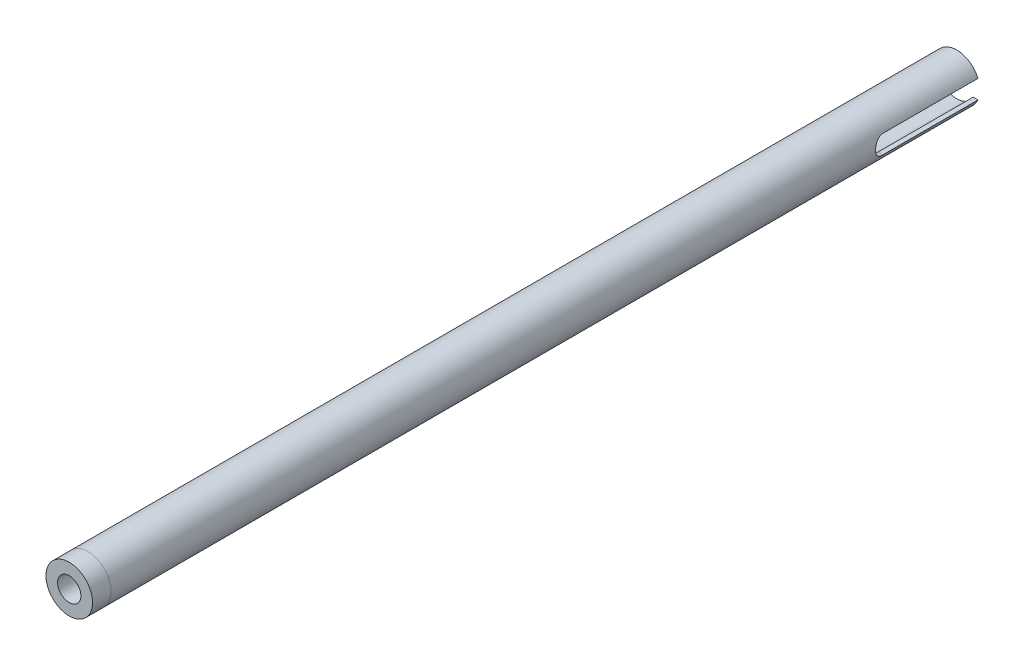
ISO-10303-21;
HEADER;
FILE_DESCRIPTION(('STEP AP214'),'2;1');
FILE_NAME('part.step','',(''),(''),'','','');
FILE_SCHEMA(('AUTOMOTIVE_DESIGN { 1 0 10303 214 1 1 1 1 }'));
ENDSEC;
DATA;
#1=APPLICATION_CONTEXT('core data for automotive mechanical design processes');
#2=APPLICATION_PROTOCOL_DEFINITION('international standard','automotive_design',2000,#1);
#3=PRODUCT_CONTEXT('',#1,'mechanical');
#4=PRODUCT('Part','Part','',(#3));
#5=PRODUCT_RELATED_PRODUCT_CATEGORY('part','',(#4));
#6=PRODUCT_DEFINITION_FORMATION('','',#4);
#7=PRODUCT_DEFINITION_CONTEXT('part definition',#1,'design');
#8=PRODUCT_DEFINITION('design','',#6,#7);
#9=PRODUCT_DEFINITION_SHAPE('','',#8);
#10=(LENGTH_UNIT() NAMED_UNIT(*) SI_UNIT(.MILLI.,.METRE.));
#11=(NAMED_UNIT(*) PLANE_ANGLE_UNIT() SI_UNIT($,.RADIAN.));
#12=(NAMED_UNIT(*) SI_UNIT($,.STERADIAN.) SOLID_ANGLE_UNIT());
#13=UNCERTAINTY_MEASURE_WITH_UNIT(LENGTH_MEASURE(1.E-05),#10,'distance_accuracy_value','');
#14=(GEOMETRIC_REPRESENTATION_CONTEXT(3) GLOBAL_UNCERTAINTY_ASSIGNED_CONTEXT((#13)) GLOBAL_UNIT_ASSIGNED_CONTEXT((#10,
#11,#12)) REPRESENTATION_CONTEXT('',''));
#15=CARTESIAN_POINT('',(0.,0.,0.));
#16=DIRECTION('',(0.,0.,1.));
#17=DIRECTION('',(1.,0.,0.));
#18=AXIS2_PLACEMENT_3D('',#15,#16,#17);
#19=CARTESIAN_POINT('',(0.,0.,-302.369232505342));
#20=DIRECTION('',(0.,0.,1.));
#21=DIRECTION('',(1.,0.,0.));
#22=AXIS2_PLACEMENT_3D('',#19,#20,#21);
#23=CYLINDRICAL_SURFACE('',#22,7.9375);
#24=CARTESIAN_POINT('',(0.,0.,-6.35));
#25=DIRECTION('',(0.,0.,1.));
#26=DIRECTION('',(1.,0.,0.));
#27=AXIS2_PLACEMENT_3D('',#24,#25,#26);
#28=CIRCLE('',#27,7.9375);
#29=CARTESIAN_POINT('',(7.9375,0.,-6.35));
#30=VERTEX_POINT('',#29);
#31=EDGE_CURVE('E170',#30,#30,#28,.T.);
#32=ORIENTED_EDGE('',*,*,#31,.F.);
#33=EDGE_LOOP('',(#32));
#34=FACE_BOUND('',#33,.T.);
#35=CARTESIAN_POINT('',(-7.2748389157424,3.175,-269.984232505342));
#36=CARTESIAN_POINT('',(-7.27482137043434,3.17501267173453,-269.89881238986));
#37=CARTESIAN_POINT('',(-7.27634297592672,3.17155313247793,-269.813401860297));
#38=CARTESIAN_POINT('',(-7.28233338484875,3.15778866907725,-269.643269855969));
#39=CARTESIAN_POINT('',(-7.28680106535325,3.14748635311323,-269.55854813111));
#40=CARTESIAN_POINT('',(-7.2985291631267,3.12019002880163,-269.390734431301));
#41=CARTESIAN_POINT('',(-7.30577831906487,3.10322299732752,-269.307637286542));
#42=CARTESIAN_POINT('',(-7.32282161153744,3.06278779397035,-269.143326184517));
#43=CARTESIAN_POINT('',(-7.33261590324725,3.03931922568674,-269.062112342403));
#44=CARTESIAN_POINT('',(-7.36535331460444,2.95952924342962,-268.822287519821));
#45=CARTESIAN_POINT('',(-7.39167595677839,2.89376893609239,-268.667162591017));
#46=CARTESIAN_POINT('',(-7.45033259991547,2.73920602658923,-268.370075164306));
#47=CARTESIAN_POINT('',(-7.48267254395243,2.65038060922872,-268.228125889088));
#48=CARTESIAN_POINT('',(-7.55175295441387,2.44684429809694,-267.953405119568));
#49=CARTESIAN_POINT('',(-7.58863404630155,2.33103943595687,-267.821477735056));
#50=CARTESIAN_POINT('',(-7.66147718953598,2.07914562663533,-267.578314851424));
#51=CARTESIAN_POINT('',(-7.69743902899202,1.94305205135846,-267.467084086497));
#52=CARTESIAN_POINT('',(-7.76611692840651,1.64778282664419,-267.264162887001));
#53=CARTESIAN_POINT('',(-7.79864638434712,1.48790317306356,-267.173428475597));
#54=CARTESIAN_POINT('',(-7.85502980346525,1.15369615984563,-267.02057092218));
#55=CARTESIAN_POINT('',(-7.87889360585224,0.979385463602722,-266.958415309562));
#56=CARTESIAN_POINT('',(-7.91022225039827,0.670405323433354,-266.877903665907));
#57=CARTESIAN_POINT('',(-7.92038443902171,0.537888188660439,-266.852225742497));
#58=CARTESIAN_POINT('',(-7.93061686811603,0.337231082382107,-266.826470659416));
#59=CARTESIAN_POINT('',(-7.93319257341971,0.269991647180298,-266.820012562135));
#60=CARTESIAN_POINT('',(-7.93663621925193,0.135173873369596,-266.811391544383));
#61=CARTESIAN_POINT('',(-7.93750363389236,0.0675954368175869,-266.809229946565));
#62=CARTESIAN_POINT('',(-7.9375,0.,-266.809232505342));
#63=B_SPLINE_CURVE_WITH_KNOTS('',3,(#35,#36,#37,#38,#39,#40,#41,#42,#43,#44,#45,#46,#47,#48,#49,
#50,#51,#52,#53,#54,#55,#56,#57,#58,#59,#60,#61,#62),.UNSPECIFIED.,.F.,.F.,(4,2,2,2,2,2,2,2,2,2,
2,2,2,4),(0.,0.256160797396612,0.512224013007058,0.767261264672238,1.02231406945471,
1.53142416248594,2.04103978047897,2.57679273649405,3.11266809162683,3.66991136029742,
4.22651992730645,4.63134321412666,4.8339937586662,5.03670667834028),.UNSPECIFIED.);
#64=CARTESIAN_POINT('',(-7.2748389157424,3.175,-269.984232505342));
#65=VERTEX_POINT('',#64);
#66=CARTESIAN_POINT('',(-7.9375,0.,-266.809232505342));
#67=VERTEX_POINT('',#66);
#68=EDGE_CURVE('E197',#65,#67,#63,.T.);
#69=ORIENTED_EDGE('',*,*,#68,.T.);
#70=CARTESIAN_POINT('',(-7.9375,0.,-266.809232505342));
#71=CARTESIAN_POINT('',(-7.93751279435796,-0.0856973243893185,-266.809220475173));
#72=CARTESIAN_POINT('',(-7.93611246860092,-0.171386675169291,-266.812701842645));
#73=CARTESIAN_POINT('',(-7.93058107051394,-0.342092796869088,-266.82655793798));
#74=CARTESIAN_POINT('',(-7.92645080745519,-0.427109759557717,-266.836930622963));
#75=CARTESIAN_POINT('',(-7.91557399086504,-0.595570690948319,-266.86442781703));
#76=CARTESIAN_POINT('',(-7.90883664469869,-0.67901912358001,-266.881528568303));
#77=CARTESIAN_POINT('',(-7.89293284658536,-0.844038966454646,-266.922295815777));
#78=CARTESIAN_POINT('',(-7.88376629739099,-0.925610301410303,-266.945962574834));
#79=CARTESIAN_POINT('',(-7.85297007832481,-1.16656173687588,-267.026470230532));
#80=CARTESIAN_POINT('',(-7.82802544143958,-1.32244720282989,-267.092862863409));
#81=CARTESIAN_POINT('',(-7.77174407779742,-1.62081902572888,-267.248908267402));
#82=CARTESIAN_POINT('',(-7.74040257287306,-1.7632952496653,-267.338578439465));
#83=CARTESIAN_POINT('',(-7.67287736621953,-2.03755465224644,-267.543032046981));
#84=CARTESIAN_POINT('',(-7.63654472176442,-2.16862853615059,-267.658718903712));
#85=CARTESIAN_POINT('',(-7.56380976030912,-2.41011022612819,-267.910013005421));
#86=CARTESIAN_POINT('',(-7.52740741976911,-2.52050895891189,-268.045628949903));
#87=CARTESIAN_POINT('',(-7.45683282624284,-2.72240939900242,-268.34032744477));
#88=CARTESIAN_POINT('',(-7.4228346735038,-2.81283701743189,-268.500191434685));
#89=CARTESIAN_POINT('',(-7.3633362219632,-2.96511894168388,-268.834317399482));
#90=CARTESIAN_POINT('',(-7.33782422493328,-3.02701262758154,-269.008559137241));
#91=CARTESIAN_POINT('',(-7.30424985403508,-3.10695047193342,-269.316862861892));
#92=CARTESIAN_POINT('',(-7.29331360019113,-3.13238569878909,-269.448721622778));
#93=CARTESIAN_POINT('',(-7.28227977674291,-3.15790858319001,-269.648438504472));
#94=CARTESIAN_POINT('',(-7.27949685702346,-3.16431127275807,-269.715386795232));
#95=CARTESIAN_POINT('',(-7.27577355567174,-3.17285909036155,-269.849628353098));
#96=CARTESIAN_POINT('',(-7.27483380475762,-3.1750027609968,-269.916921730396));
#97=CARTESIAN_POINT('',(-7.2748389157424,-3.175,-269.984232505342));
#98=B_SPLINE_CURVE_WITH_KNOTS('',3,(#70,#71,#72,#73,#74,#75,#76,#77,#78,#79,#80,#81,#82,#83,#84,
#85,#86,#87,#88,#89,#90,#91,#92,#93,#94,#95,#96,#97),.UNSPECIFIED.,.F.,.F.,(4,2,2,2,2,2,2,2,2,2,
2,2,2,4),(0.,0.256996432008007,0.513916713336978,0.769937797705386,1.02596913282157,
1.53722547809954,2.04886511530059,2.58219314099272,3.11575467201799,3.67332953074261,
4.2301325519037,4.63306130520181,4.83485003827446,5.03670780985612),.UNSPECIFIED.);
#99=CARTESIAN_POINT('',(-7.2748389157424,-3.175,-269.984232505342));
#100=VERTEX_POINT('',#99);
#101=EDGE_CURVE('E149',#67,#100,#98,.T.);
#102=ORIENTED_EDGE('',*,*,#101,.T.);
#103=DIRECTION('',(0.,0.,-1.));
#104=VECTOR('',#103,1.);
#105=CARTESIAN_POINT('',(-7.2748389157424,-3.175,-266.809232505342));
#106=LINE('',#105,#104);
#107=CARTESIAN_POINT('',(-7.2748389157424,-3.175,-302.369232505342));
#108=VERTEX_POINT('',#107);
#109=EDGE_CURVE('E144',#100,#108,#106,.T.);
#110=ORIENTED_EDGE('',*,*,#109,.T.);
#111=CARTESIAN_POINT('',(0.,0.,-302.369232505342));
#112=DIRECTION('',(0.,0.,1.));
#113=DIRECTION('',(1.,0.,0.));
#114=AXIS2_PLACEMENT_3D('',#111,#112,#113);
#115=CIRCLE('',#114,7.9375);
#116=CARTESIAN_POINT('',(7.2748389157424,-3.175,-302.369232505342));
#117=VERTEX_POINT('',#116);
#118=EDGE_CURVE('E147',#108,#117,#115,.T.);
#119=ORIENTED_EDGE('',*,*,#118,.T.);
#120=DIRECTION('',(0.,0.,-1.));
#121=VECTOR('',#120,1.);
#122=CARTESIAN_POINT('',(7.2748389157424,-3.175,-266.809232505342));
#123=LINE('',#122,#121);
#124=CARTESIAN_POINT('',(7.2748389157424,-3.175,-269.984232505342));
#125=VERTEX_POINT('',#124);
#126=EDGE_CURVE('E430',#125,#117,#123,.T.);
#127=ORIENTED_EDGE('',*,*,#126,.F.);
#128=CARTESIAN_POINT('',(7.2748389157424,-3.175,-269.984232505342));
#129=CARTESIAN_POINT('',(7.27482137043434,-3.17501267173453,-269.89881238986));
#130=CARTESIAN_POINT('',(7.27634297592672,-3.17155313247793,-269.813401860297));
#131=CARTESIAN_POINT('',(7.28233338484875,-3.15778866907725,-269.643269855969));
#132=CARTESIAN_POINT('',(7.28680106535325,-3.14748635311323,-269.55854813111));
#133=CARTESIAN_POINT('',(7.2985291631267,-3.12019002880163,-269.390734431301));
#134=CARTESIAN_POINT('',(7.30577831906487,-3.10322299732752,-269.307637286542));
#135=CARTESIAN_POINT('',(7.32282161153744,-3.06278779397035,-269.143326184517));
#136=CARTESIAN_POINT('',(7.33261590324725,-3.03931922568674,-269.062112342403));
#137=CARTESIAN_POINT('',(7.36535331460444,-2.95952924342962,-268.822287519821));
#138=CARTESIAN_POINT('',(7.39167595677839,-2.89376893609239,-268.667162591017));
#139=CARTESIAN_POINT('',(7.45033259991547,-2.73920602658923,-268.370075164306));
#140=CARTESIAN_POINT('',(7.48267254395243,-2.65038060922872,-268.228125889088));
#141=CARTESIAN_POINT('',(7.55175295441387,-2.44684429809694,-267.953405119568));
#142=CARTESIAN_POINT('',(7.58863404630155,-2.33103943595687,-267.821477735056));
#143=CARTESIAN_POINT('',(7.66147718953598,-2.07914562663533,-267.578314851424));
#144=CARTESIAN_POINT('',(7.69743902899202,-1.94305205135846,-267.467084086497));
#145=CARTESIAN_POINT('',(7.76611692840651,-1.64778282664419,-267.264162887001));
#146=CARTESIAN_POINT('',(7.79864638434712,-1.48790317306356,-267.173428475597));
#147=CARTESIAN_POINT('',(7.85502980346525,-1.15369615984563,-267.02057092218));
#148=CARTESIAN_POINT('',(7.87889360585224,-0.979385463602722,-266.958415309562));
#149=CARTESIAN_POINT('',(7.91022225039827,-0.670405323433354,-266.877903665907));
#150=CARTESIAN_POINT('',(7.92038443902171,-0.537888188660439,-266.852225742497));
#151=CARTESIAN_POINT('',(7.93061686811603,-0.337231082382107,-266.826470659416));
#152=CARTESIAN_POINT('',(7.93319257341971,-0.269991647180298,-266.820012562135));
#153=CARTESIAN_POINT('',(7.93663621925193,-0.135173873369596,-266.811391544383));
#154=CARTESIAN_POINT('',(7.93750363389236,-0.0675954368175869,-266.809229946565));
#155=CARTESIAN_POINT('',(7.9375,0.,-266.809232505342));
#156=B_SPLINE_CURVE_WITH_KNOTS('',3,(#128,#129,#130,#131,#132,#133,#134,#135,#136,#137,#138,
#139,#140,#141,#142,#143,#144,#145,#146,#147,#148,#149,#150,#151,#152,#153,#154,#155),
.UNSPECIFIED.,.F.,.F.,(4,2,2,2,2,2,2,2,2,2,2,2,2,4),(0.,0.256160797396612,0.512224013007058,
0.767261264672238,1.02231406945471,1.53142416248594,2.04103978047897,2.57679273649405,
3.11266809162683,3.66991136029742,4.22651992730645,4.63134321412666,4.8339937586662,
5.03670667834028),.UNSPECIFIED.);
#157=CARTESIAN_POINT('',(7.9375,0.,-266.809232505342));
#158=VERTEX_POINT('',#157);
#159=EDGE_CURVE('E90',#125,#158,#156,.T.);
#160=ORIENTED_EDGE('',*,*,#159,.T.);
#161=CARTESIAN_POINT('',(7.9375,0.,-266.809232505342));
#162=CARTESIAN_POINT('',(7.93751279435796,0.0856973243893185,-266.809220475173));
#163=CARTESIAN_POINT('',(7.93611246860092,0.171386675169291,-266.812701842645));
#164=CARTESIAN_POINT('',(7.93058107051394,0.342092796869088,-266.82655793798));
#165=CARTESIAN_POINT('',(7.92645080745519,0.427109759557717,-266.836930622963));
#166=CARTESIAN_POINT('',(7.91557399086504,0.595570690948319,-266.86442781703));
#167=CARTESIAN_POINT('',(7.90883664469869,0.67901912358001,-266.881528568303));
#168=CARTESIAN_POINT('',(7.89293284658536,0.844038966454646,-266.922295815777));
#169=CARTESIAN_POINT('',(7.88376629739099,0.925610301410303,-266.945962574834));
#170=CARTESIAN_POINT('',(7.85297007832481,1.16656173687588,-267.026470230532));
#171=CARTESIAN_POINT('',(7.82802544143958,1.32244720282989,-267.092862863409));
#172=CARTESIAN_POINT('',(7.77174407779742,1.62081902572888,-267.248908267402));
#173=CARTESIAN_POINT('',(7.74040257287306,1.7632952496653,-267.338578439465));
#174=CARTESIAN_POINT('',(7.67287736621953,2.03755465224644,-267.543032046981));
#175=CARTESIAN_POINT('',(7.63654472176442,2.16862853615059,-267.658718903712));
#176=CARTESIAN_POINT('',(7.56380976030912,2.41011022612819,-267.910013005421));
#177=CARTESIAN_POINT('',(7.52740741976911,2.52050895891189,-268.045628949903));
#178=CARTESIAN_POINT('',(7.45683282624284,2.72240939900242,-268.34032744477));
#179=CARTESIAN_POINT('',(7.4228346735038,2.81283701743189,-268.500191434685));
#180=CARTESIAN_POINT('',(7.3633362219632,2.96511894168388,-268.834317399482));
#181=CARTESIAN_POINT('',(7.33782422493328,3.02701262758154,-269.008559137241));
#182=CARTESIAN_POINT('',(7.30424985403508,3.10695047193342,-269.316862861892));
#183=CARTESIAN_POINT('',(7.29331360019113,3.13238569878909,-269.448721622778));
#184=CARTESIAN_POINT('',(7.28227977674291,3.15790858319001,-269.648438504472));
#185=CARTESIAN_POINT('',(7.27949685702346,3.16431127275807,-269.715386795232));
#186=CARTESIAN_POINT('',(7.27577355567174,3.17285909036155,-269.849628353098));
#187=CARTESIAN_POINT('',(7.27483380475762,3.1750027609968,-269.916921730396));
#188=CARTESIAN_POINT('',(7.2748389157424,3.175,-269.984232505342));
#189=B_SPLINE_CURVE_WITH_KNOTS('',3,(#161,#162,#163,#164,#165,#166,#167,#168,#169,#170,#171,
#172,#173,#174,#175,#176,#177,#178,#179,#180,#181,#182,#183,#184,#185,#186,#187,#188),
.UNSPECIFIED.,.F.,.F.,(4,2,2,2,2,2,2,2,2,2,2,2,2,4),(0.,0.256996432008007,0.513916713336978,
0.769937797705386,1.02596913282157,1.53722547809954,2.04886511530059,2.58219314099272,
3.11575467201799,3.67332953074261,4.2301325519037,4.63306130520181,4.83485003827446,
5.03670780985612),.UNSPECIFIED.);
#190=CARTESIAN_POINT('',(7.2748389157424,3.175,-269.984232505342));
#191=VERTEX_POINT('',#190);
#192=EDGE_CURVE('E76',#158,#191,#189,.T.);
#193=ORIENTED_EDGE('',*,*,#192,.T.);
#194=DIRECTION('',(0.,0.,-1.));
#195=VECTOR('',#194,1.);
#196=CARTESIAN_POINT('',(7.2748389157424,3.175,-266.809232505342));
#197=LINE('',#196,#195);
#198=CARTESIAN_POINT('',(7.2748389157424,3.175,-302.369232505342));
#199=VERTEX_POINT('',#198);
#200=EDGE_CURVE('E163',#191,#199,#197,.T.);
#201=ORIENTED_EDGE('',*,*,#200,.T.);
#202=CARTESIAN_POINT('',(-7.2748389157424,3.175,-302.369232505342));
#203=VERTEX_POINT('',#202);
#204=EDGE_CURVE('E169',#199,#203,#115,.T.);
#205=ORIENTED_EDGE('',*,*,#204,.T.);
#206=DIRECTION('',(0.,0.,-1.));
#207=VECTOR('',#206,1.);
#208=CARTESIAN_POINT('',(-7.2748389157424,3.175,-266.809232505342));
#209=LINE('',#208,#207);
#210=EDGE_CURVE('E423',#65,#203,#209,.T.);
#211=ORIENTED_EDGE('',*,*,#210,.F.);
#212=EDGE_LOOP('',(#69,#102,#110,#119,#127,#160,#193,#201,#205,#211));
#213=FACE_BOUND('',#212,.T.);
#214=ADVANCED_FACE('F66',(#34,#213),#23,.T.);
#215=CARTESIAN_POINT('',(0.,0.,-302.369232505342));
#216=DIRECTION('',(0.,0.,1.));
#217=DIRECTION('',(1.,0.,0.));
#218=AXIS2_PLACEMENT_3D('',#215,#216,#217);
#219=PLANE('',#218);
#220=DIRECTION('',(1.,0.,0.));
#221=VECTOR('',#220,1.);
#222=CARTESIAN_POINT('',(0.,-3.175,-302.369232505342));
#223=LINE('',#222,#221);
#224=CARTESIAN_POINT('',(-5.63085690548073,-3.175,-302.369232505342));
#225=VERTEX_POINT('',#224);
#226=EDGE_CURVE('E156',#108,#225,#223,.T.);
#227=ORIENTED_EDGE('',*,*,#226,.T.);
#228=CARTESIAN_POINT('',(0.,0.,-302.369232505342));
#229=DIRECTION('',(0.,0.,1.));
#230=DIRECTION('',(1.,0.,0.));
#231=AXIS2_PLACEMENT_3D('',#228,#229,#230);
#232=CIRCLE('',#231,6.4643);
#233=CARTESIAN_POINT('',(5.63085690548073,-3.175,-302.369232505342));
#234=VERTEX_POINT('',#233);
#235=EDGE_CURVE('E278',#225,#234,#232,.T.);
#236=ORIENTED_EDGE('',*,*,#235,.T.);
#237=DIRECTION('',(1.,0.,0.));
#238=VECTOR('',#237,1.);
#239=CARTESIAN_POINT('',(0.,-3.175,-302.369232505342));
#240=LINE('',#239,#238);
#241=EDGE_CURVE('E168',#234,#117,#240,.T.);
#242=ORIENTED_EDGE('',*,*,#241,.T.);
#243=ORIENTED_EDGE('',*,*,#118,.F.);
#244=EDGE_LOOP('',(#227,#236,#242,#243));
#245=FACE_BOUND('',#244,.T.);
#246=ADVANCED_FACE('F166',(#245),#219,.F.);
#247=CARTESIAN_POINT('',(0.,0.,-302.369232505342));
#248=DIRECTION('',(0.,0.,1.));
#249=DIRECTION('',(1.,0.,0.));
#250=AXIS2_PLACEMENT_3D('',#247,#248,#249);
#251=CYLINDRICAL_SURFACE('',#250,6.4643);
#252=CARTESIAN_POINT('',(0.,0.,-6.35));
#253=DIRECTION('',(0.,0.,1.));
#254=DIRECTION('',(1.,0.,0.));
#255=AXIS2_PLACEMENT_3D('',#252,#253,#254);
#256=CIRCLE('',#255,6.4643);
#257=CARTESIAN_POINT('',(6.4643,0.,-6.35));
#258=VERTEX_POINT('',#257);
#259=EDGE_CURVE('E152',#258,#258,#256,.T.);
#260=ORIENTED_EDGE('',*,*,#259,.T.);
#261=EDGE_LOOP('',(#260));
#262=FACE_BOUND('',#261,.T.);
#263=DIRECTION('',(0.,0.,-1.));
#264=VECTOR('',#263,1.);
#265=CARTESIAN_POINT('',(-5.63085690548073,-3.175,-266.809232505342));
#266=LINE('',#265,#264);
#267=CARTESIAN_POINT('',(-5.63085690548073,-3.175,-269.984232505342));
#268=VERTEX_POINT('',#267);
#269=EDGE_CURVE('E153',#268,#225,#266,.T.);
#270=ORIENTED_EDGE('',*,*,#269,.F.);
#271=CARTESIAN_POINT('',(-5.63085690548073,-3.175,-269.984232505342));
#272=CARTESIAN_POINT('',(-5.63083313994649,-3.17501475983035,-269.900855670622));
#273=CARTESIAN_POINT('',(-5.63270815771784,-3.17171623434453,-269.817491995453));
#274=CARTESIAN_POINT('',(-5.64007695954704,-3.15860868668088,-269.651486853357));
#275=CARTESIAN_POINT('',(-5.645568609108,-3.14880350463522,-269.568844989558));
#276=CARTESIAN_POINT('',(-5.65995160356269,-3.12287177657854,-269.405341724888));
#277=CARTESIAN_POINT('',(-5.66882360641349,-3.10678118209035,-269.324472912708));
#278=CARTESIAN_POINT('',(-5.68964253084949,-3.06848763641647,-269.164615532981));
#279=CARTESIAN_POINT('',(-5.70158978762268,-3.0462840189221,-269.085627171421));
#280=CARTESIAN_POINT('',(-5.74141867016874,-2.9709479042579,-268.85256892546));
#281=CARTESIAN_POINT('',(-5.77333273238342,-2.90901346570841,-268.701932384826));
#282=CARTESIAN_POINT('',(-5.84425759514897,-2.763754188191,-268.413077279991));
#283=CARTESIAN_POINT('',(-5.88327925344641,-2.68039654138926,-268.274878204928));
#284=CARTESIAN_POINT('',(-5.96775435279507,-2.48697819565355,-268.002937166689));
#285=CARTESIAN_POINT('',(-6.01347229172614,-2.37533204038057,-267.87040236034));
#286=CARTESIAN_POINT('',(-6.10404593063631,-2.13182339161096,-267.625026777262));
#287=CARTESIAN_POINT('',(-6.14890136897125,-1.99995486913048,-267.512191895284));
#288=CARTESIAN_POINT('',(-6.23619220514827,-1.70925564842441,-267.302208511363));
#289=CARTESIAN_POINT('',(-6.27828027392068,-1.54922894444793,-267.206558235634));
#290=CARTESIAN_POINT('',(-6.351789494002,-1.21302302470908,-267.044174330417));
#291=CARTESIAN_POINT('',(-6.3832266631188,-1.03686857473503,-266.977397236613));
#292=CARTESIAN_POINT('',(-6.42590822780063,-0.717171909263578,-266.887964589305));
#293=CARTESIAN_POINT('',(-6.4401838278065,-0.575906031157537,-266.858576344383));
#294=CARTESIAN_POINT('',(-6.45458743188517,-0.361448476439118,-266.829043624721));
#295=CARTESIAN_POINT('',(-6.45822048728408,-0.289432204318672,-266.82162417996));
#296=CARTESIAN_POINT('',(-6.46308007773031,-0.144952050292043,-266.8117157078));
#297=CARTESIAN_POINT('',(-6.46430565210199,-0.072488001271515,-266.809228648604));
#298=CARTESIAN_POINT('',(-6.4643,0.,-266.809232505342));
#299=B_SPLINE_CURVE_WITH_KNOTS('',3,(#271,#272,#273,#274,#275,#276,#277,#278,#279,#280,#281,
#282,#283,#284,#285,#286,#287,#288,#289,#290,#291,#292,#293,#294,#295,#296,#297,#298),
.UNSPECIFIED.,.F.,.F.,(4,2,2,2,2,2,2,2,2,2,2,2,2,4),(0.,0.250022608278555,0.499897788003946,
0.748364171658939,0.996857648438736,1.49241740389683,1.9887406369739,2.52413245916958,
3.05968421153491,3.63008006190818,4.19961425046545,4.63293550793411,4.85021333970384,
5.06757785591817),.UNSPECIFIED.);
#300=CARTESIAN_POINT('',(-6.4643,0.,-266.809232505342));
#301=VERTEX_POINT('',#300);
#302=EDGE_CURVE('E224',#268,#301,#299,.T.);
#303=ORIENTED_EDGE('',*,*,#302,.T.);
#304=CARTESIAN_POINT('',(-6.4643,0.,-266.809232505342));
#305=CARTESIAN_POINT('',(-6.46431471784482,0.0839947643435499,-266.809219161216));
#306=CARTESIAN_POINT('',(-6.46266329267846,0.167980128010398,-266.812565260585));
#307=CARTESIAN_POINT('',(-6.45613851930725,0.335267070847885,-266.825872714188));
#308=CARTESIAN_POINT('',(-6.45126643524264,0.418568905327645,-266.835831472896));
#309=CARTESIAN_POINT('',(-6.4384393661228,0.583520093709583,-266.862201515365));
#310=CARTESIAN_POINT('',(-6.43049830091841,0.665175181914776,-266.878583669613));
#311=CARTESIAN_POINT('',(-6.41174605062734,0.826621713408832,-266.917601209367));
#312=CARTESIAN_POINT('',(-6.40093469346325,0.906413044651103,-266.940236969787));
#313=CARTESIAN_POINT('',(-6.3645999533627,1.14200454475575,-267.017136533879));
#314=CARTESIAN_POINT('',(-6.33514826225986,1.29435730209625,-267.080447167062));
#315=CARTESIAN_POINT('',(-6.26847721301058,1.5861501237047,-267.228938666892));
#316=CARTESIAN_POINT('',(-6.23125016174678,1.7255772002446,-267.314141213258));
#317=CARTESIAN_POINT('',(-6.14993667819984,1.99664965861336,-267.509655159387));
#318=CARTESIAN_POINT('',(-6.10557667432164,2.12736555519219,-267.621142019038));
#319=CARTESIAN_POINT('',(-6.01591119010693,2.36910305567939,-267.86354444222));
#320=CARTESIAN_POINT('',(-5.97060501254448,2.4801095192896,-267.994474801206));
#321=CARTESIAN_POINT('',(-5.88028635793905,2.68759195973766,-268.283797139949));
#322=CARTESIAN_POINT('',(-5.83554983812279,2.78235777578918,-268.443511242602));
#323=CARTESIAN_POINT('',(-5.75613746809778,2.94315382396594,-268.778862487178));
#324=CARTESIAN_POINT('',(-5.72144095718824,3.00924320962384,-268.954465939032));
#325=CARTESIAN_POINT('',(-5.67404956693615,3.09744900867387,-269.272470240718));
#326=CARTESIAN_POINT('',(-5.65804978215016,3.12636521602239,-269.41249493066));
#327=CARTESIAN_POINT('',(-5.64184153899281,3.1554574998571,-269.625243229271));
#328=CARTESIAN_POINT('',(-5.63773701667688,3.16277482388528,-269.696753117375));
#329=CARTESIAN_POINT('',(-5.63223913004552,3.17254960488947,-269.840244179146));
#330=CARTESIAN_POINT('',(-5.6308471601211,3.17500456237039,-269.912225576127));
#331=CARTESIAN_POINT('',(-5.63085690548073,3.175,-269.984232505342));
#332=B_SPLINE_CURVE_WITH_KNOTS('',3,(#304,#305,#306,#307,#308,#309,#310,#311,#312,#313,#314,
#315,#316,#317,#318,#319,#320,#321,#322,#323,#324,#325,#326,#327,#328,#329,#330,#331),
.UNSPECIFIED.,.F.,.F.,(4,2,2,2,2,2,2,2,2,2,2,2,2,4),(0.,0.251885801688016,0.503672794384369,
0.754330922106977,1.00500408047846,1.50534146760879,2.00617626510683,2.53624961383851,
3.06672840649523,3.63692439554961,4.20593853113138,4.63586569132644,4.85167139809474,
5.06758801082739),.UNSPECIFIED.);
#333=CARTESIAN_POINT('',(-5.63085690548073,3.175,-269.984232505342));
#334=VERTEX_POINT('',#333);
#335=EDGE_CURVE('E189',#301,#334,#332,.T.);
#336=ORIENTED_EDGE('',*,*,#335,.T.);
#337=DIRECTION('',(0.,0.,-1.));
#338=VECTOR('',#337,1.);
#339=CARTESIAN_POINT('',(-5.63085690548073,3.175,-266.809232505342));
#340=LINE('',#339,#338);
#341=CARTESIAN_POINT('',(-5.63085690548073,3.175,-302.369232505342));
#342=VERTEX_POINT('',#341);
#343=EDGE_CURVE('E420',#334,#342,#340,.T.);
#344=ORIENTED_EDGE('',*,*,#343,.T.);
#345=CARTESIAN_POINT('',(5.63085690548073,3.175,-302.369232505342));
#346=VERTEX_POINT('',#345);
#347=EDGE_CURVE('E175',#346,#342,#232,.T.);
#348=ORIENTED_EDGE('',*,*,#347,.F.);
#349=DIRECTION('',(0.,0.,-1.));
#350=VECTOR('',#349,1.);
#351=CARTESIAN_POINT('',(5.63085690548073,3.175,-266.809232505342));
#352=LINE('',#351,#350);
#353=CARTESIAN_POINT('',(5.63085690548073,3.175,-269.984232505342));
#354=VERTEX_POINT('',#353);
#355=EDGE_CURVE('E272',#354,#346,#352,.T.);
#356=ORIENTED_EDGE('',*,*,#355,.F.);
#357=CARTESIAN_POINT('',(5.63085690548073,3.175,-269.984232505342));
#358=CARTESIAN_POINT('',(5.63083313994649,3.17501475983035,-269.900855670622));
#359=CARTESIAN_POINT('',(5.63270815771784,3.17171623434453,-269.817491995453));
#360=CARTESIAN_POINT('',(5.64007695954704,3.15860868668088,-269.651486853357));
#361=CARTESIAN_POINT('',(5.645568609108,3.14880350463522,-269.568844989558));
#362=CARTESIAN_POINT('',(5.65995160356269,3.12287177657854,-269.405341724888));
#363=CARTESIAN_POINT('',(5.66882360641349,3.10678118209035,-269.324472912708));
#364=CARTESIAN_POINT('',(5.68964253084949,3.06848763641647,-269.164615532981));
#365=CARTESIAN_POINT('',(5.70158978762268,3.0462840189221,-269.085627171421));
#366=CARTESIAN_POINT('',(5.74141867016874,2.9709479042579,-268.85256892546));
#367=CARTESIAN_POINT('',(5.77333273238342,2.90901346570841,-268.701932384826));
#368=CARTESIAN_POINT('',(5.84425759514897,2.763754188191,-268.413077279991));
#369=CARTESIAN_POINT('',(5.88327925344641,2.68039654138926,-268.274878204928));
#370=CARTESIAN_POINT('',(5.96775435279507,2.48697819565355,-268.002937166689));
#371=CARTESIAN_POINT('',(6.01347229172614,2.37533204038057,-267.87040236034));
#372=CARTESIAN_POINT('',(6.10404593063631,2.13182339161096,-267.625026777262));
#373=CARTESIAN_POINT('',(6.14890136897125,1.99995486913048,-267.512191895284));
#374=CARTESIAN_POINT('',(6.23619220514827,1.70925564842441,-267.302208511363));
#375=CARTESIAN_POINT('',(6.27828027392068,1.54922894444793,-267.206558235634));
#376=CARTESIAN_POINT('',(6.351789494002,1.21302302470908,-267.044174330417));
#377=CARTESIAN_POINT('',(6.3832266631188,1.03686857473503,-266.977397236613));
#378=CARTESIAN_POINT('',(6.42590822780063,0.717171909263578,-266.887964589305));
#379=CARTESIAN_POINT('',(6.4401838278065,0.575906031157537,-266.858576344383));
#380=CARTESIAN_POINT('',(6.45458743188517,0.361448476439118,-266.829043624721));
#381=CARTESIAN_POINT('',(6.45822048728408,0.289432204318672,-266.82162417996));
#382=CARTESIAN_POINT('',(6.46308007773031,0.144952050292043,-266.8117157078));
#383=CARTESIAN_POINT('',(6.46430565210199,0.072488001271515,-266.809228648604));
#384=CARTESIAN_POINT('',(6.4643,0.,-266.809232505342));
#385=B_SPLINE_CURVE_WITH_KNOTS('',3,(#357,#358,#359,#360,#361,#362,#363,#364,#365,#366,#367,
#368,#369,#370,#371,#372,#373,#374,#375,#376,#377,#378,#379,#380,#381,#382,#383,#384),
.UNSPECIFIED.,.F.,.F.,(4,2,2,2,2,2,2,2,2,2,2,2,2,4),(0.,0.250022608278555,0.499897788003946,
0.748364171658939,0.996857648438736,1.49241740389683,1.9887406369739,2.52413245916958,
3.05968421153491,3.63008006190818,4.19961425046545,4.63293550793411,4.85021333970384,
5.06757785591817),.UNSPECIFIED.);
#386=CARTESIAN_POINT('',(6.4643,0.,-266.809232505342));
#387=VERTEX_POINT('',#386);
#388=EDGE_CURVE('E13',#354,#387,#385,.T.);
#389=ORIENTED_EDGE('',*,*,#388,.T.);
#390=CARTESIAN_POINT('',(6.4643,0.,-266.809232505342));
#391=CARTESIAN_POINT('',(6.46431471784482,-0.0839947643435499,-266.809219161216));
#392=CARTESIAN_POINT('',(6.46266329267846,-0.167980128010398,-266.812565260585));
#393=CARTESIAN_POINT('',(6.45613851930725,-0.335267070847885,-266.825872714188));
#394=CARTESIAN_POINT('',(6.45126643524264,-0.418568905327645,-266.835831472896));
#395=CARTESIAN_POINT('',(6.4384393661228,-0.583520093709583,-266.862201515365));
#396=CARTESIAN_POINT('',(6.43049830091841,-0.665175181914776,-266.878583669613));
#397=CARTESIAN_POINT('',(6.41174605062734,-0.826621713408832,-266.917601209367));
#398=CARTESIAN_POINT('',(6.40093469346325,-0.906413044651103,-266.940236969787));
#399=CARTESIAN_POINT('',(6.3645999533627,-1.14200454475575,-267.017136533879));
#400=CARTESIAN_POINT('',(6.33514826225986,-1.29435730209625,-267.080447167062));
#401=CARTESIAN_POINT('',(6.26847721301058,-1.5861501237047,-267.228938666892));
#402=CARTESIAN_POINT('',(6.23125016174678,-1.7255772002446,-267.314141213258));
#403=CARTESIAN_POINT('',(6.14993667819984,-1.99664965861336,-267.509655159387));
#404=CARTESIAN_POINT('',(6.10557667432164,-2.12736555519219,-267.621142019038));
#405=CARTESIAN_POINT('',(6.01591119010693,-2.36910305567939,-267.86354444222));
#406=CARTESIAN_POINT('',(5.97060501254448,-2.4801095192896,-267.994474801206));
#407=CARTESIAN_POINT('',(5.88028635793905,-2.68759195973766,-268.283797139949));
#408=CARTESIAN_POINT('',(5.83554983812279,-2.78235777578918,-268.443511242602));
#409=CARTESIAN_POINT('',(5.75613746809778,-2.94315382396594,-268.778862487178));
#410=CARTESIAN_POINT('',(5.72144095718824,-3.00924320962384,-268.954465939032));
#411=CARTESIAN_POINT('',(5.67404956693615,-3.09744900867387,-269.272470240718));
#412=CARTESIAN_POINT('',(5.65804978215016,-3.12636521602239,-269.41249493066));
#413=CARTESIAN_POINT('',(5.64184153899281,-3.1554574998571,-269.625243229271));
#414=CARTESIAN_POINT('',(5.63773701667688,-3.16277482388528,-269.696753117375));
#415=CARTESIAN_POINT('',(5.63223913004552,-3.17254960488947,-269.840244179146));
#416=CARTESIAN_POINT('',(5.6308471601211,-3.17500456237039,-269.912225576127));
#417=CARTESIAN_POINT('',(5.63085690548073,-3.175,-269.984232505342));
#418=B_SPLINE_CURVE_WITH_KNOTS('',3,(#390,#391,#392,#393,#394,#395,#396,#397,#398,#399,#400,
#401,#402,#403,#404,#405,#406,#407,#408,#409,#410,#411,#412,#413,#414,#415,#416,#417),
.UNSPECIFIED.,.F.,.F.,(4,2,2,2,2,2,2,2,2,2,2,2,2,4),(0.,0.251885801688016,0.503672794384369,
0.754330922106977,1.00500408047846,1.50534146760879,2.00617626510683,2.53624961383851,
3.06672840649523,3.63692439554961,4.20593853113138,4.63586569132644,4.85167139809474,
5.06758801082739),.UNSPECIFIED.);
#419=CARTESIAN_POINT('',(5.63085690548073,-3.175,-269.984232505342));
#420=VERTEX_POINT('',#419);
#421=EDGE_CURVE('E240',#387,#420,#418,.T.);
#422=ORIENTED_EDGE('',*,*,#421,.T.);
#423=DIRECTION('',(0.,0.,-1.));
#424=VECTOR('',#423,1.);
#425=CARTESIAN_POINT('',(5.63085690548073,-3.175,-266.809232505342));
#426=LINE('',#425,#424);
#427=EDGE_CURVE('E274',#420,#234,#426,.T.);
#428=ORIENTED_EDGE('',*,*,#427,.T.);
#429=ORIENTED_EDGE('',*,*,#235,.F.);
#430=EDGE_LOOP('',(#270,#303,#336,#344,#348,#356,#389,#422,#428,#429));
#431=FACE_BOUND('',#430,.T.);
#432=ADVANCED_FACE('F204',(#262,#431),#251,.F.);
#433=ORIENTED_EDGE('',*,*,#347,.T.);
#434=DIRECTION('',(1.,0.,0.));
#435=VECTOR('',#434,1.);
#436=CARTESIAN_POINT('',(0.,3.175,-302.369232505342));
#437=LINE('',#436,#435);
#438=EDGE_CURVE('E162',#203,#342,#437,.T.);
#439=ORIENTED_EDGE('',*,*,#438,.F.);
#440=ORIENTED_EDGE('',*,*,#204,.F.);
#441=DIRECTION('',(1.,0.,0.));
#442=VECTOR('',#441,1.);
#443=CARTESIAN_POINT('',(0.,3.175,-302.369232505342));
#444=LINE('',#443,#442);
#445=EDGE_CURVE('E256',#346,#199,#444,.T.);
#446=ORIENTED_EDGE('',*,*,#445,.F.);
#447=EDGE_LOOP('',(#433,#439,#440,#446));
#448=FACE_BOUND('',#447,.T.);
#449=ADVANCED_FACE('F289',(#448),#219,.F.);
#450=CARTESIAN_POINT('',(0.,0.,-6.35));
#451=DIRECTION('',(0.,0.,1.));
#452=DIRECTION('',(1.,0.,0.));
#453=AXIS2_PLACEMENT_3D('',#450,#451,#452);
#454=PLANE('',#453);
#455=ORIENTED_EDGE('',*,*,#259,.F.);
#456=EDGE_LOOP('',(#455));
#457=FACE_BOUND('',#456,.T.);
#458=ORIENTED_EDGE('',*,*,#31,.T.);
#459=EDGE_LOOP('',(#458));
#460=FACE_BOUND('',#459,.T.);
#461=ADVANCED_FACE('F286',(#457,#460),#454,.T.);
#462=CARTESIAN_POINT('',(0.,3.175,-266.809232505342));
#463=DIRECTION('',(0.,1.,0.));
#464=DIRECTION('',(0.,0.,1.));
#465=AXIS2_PLACEMENT_3D('',#462,#463,#464);
#466=PLANE('',#465);
#467=ORIENTED_EDGE('',*,*,#200,.F.);
#468=DIRECTION('',(1.,0.,0.));
#469=VECTOR('',#468,1.);
#470=CARTESIAN_POINT('',(5.63085690548073,3.175,-269.984232505342));
#471=LINE('',#470,#469);
#472=EDGE_CURVE('E187',#191,#354,#471,.F.);
#473=ORIENTED_EDGE('',*,*,#472,.T.);
#474=ORIENTED_EDGE('',*,*,#355,.T.);
#475=ORIENTED_EDGE('',*,*,#445,.T.);
#476=EDGE_LOOP('',(#467,#473,#474,#475));
#477=FACE_BOUND('',#476,.T.);
#478=ADVANCED_FACE('F269',(#477),#466,.F.);
#479=CARTESIAN_POINT('',(0.,-3.175,-266.809232505342));
#480=DIRECTION('',(0.,1.,0.));
#481=DIRECTION('',(0.,0.,1.));
#482=AXIS2_PLACEMENT_3D('',#479,#480,#481);
#483=PLANE('',#482);
#484=ORIENTED_EDGE('',*,*,#427,.F.);
#485=DIRECTION('',(1.,0.,0.));
#486=VECTOR('',#485,1.);
#487=CARTESIAN_POINT('',(0.,-3.175,-269.984232505342));
#488=LINE('',#487,#486);
#489=EDGE_CURVE('E184',#420,#125,#488,.T.);
#490=ORIENTED_EDGE('',*,*,#489,.T.);
#491=ORIENTED_EDGE('',*,*,#126,.T.);
#492=ORIENTED_EDGE('',*,*,#241,.F.);
#493=EDGE_LOOP('',(#484,#490,#491,#492));
#494=FACE_BOUND('',#493,.T.);
#495=ADVANCED_FACE('F364',(#494),#483,.T.);
#496=CARTESIAN_POINT('',(0.,-3.175,-266.809232505342));
#497=DIRECTION('',(0.,1.,0.));
#498=DIRECTION('',(0.,0.,1.));
#499=AXIS2_PLACEMENT_3D('',#496,#497,#498);
#500=PLANE('',#499);
#501=ORIENTED_EDGE('',*,*,#109,.F.);
#502=DIRECTION('',(1.,0.,0.));
#503=VECTOR('',#502,1.);
#504=CARTESIAN_POINT('',(0.,-3.175,-269.984232505342));
#505=LINE('',#504,#503);
#506=EDGE_CURVE('E182',#100,#268,#505,.T.);
#507=ORIENTED_EDGE('',*,*,#506,.T.);
#508=ORIENTED_EDGE('',*,*,#269,.T.);
#509=ORIENTED_EDGE('',*,*,#226,.F.);
#510=EDGE_LOOP('',(#501,#507,#508,#509));
#511=FACE_BOUND('',#510,.T.);
#512=ADVANCED_FACE('F157',(#511),#500,.T.);
#513=CARTESIAN_POINT('',(0.,3.175,-266.809232505342));
#514=DIRECTION('',(0.,1.,0.));
#515=DIRECTION('',(0.,0.,1.));
#516=AXIS2_PLACEMENT_3D('',#513,#514,#515);
#517=PLANE('',#516);
#518=ORIENTED_EDGE('',*,*,#343,.F.);
#519=DIRECTION('',(1.,0.,0.));
#520=VECTOR('',#519,1.);
#521=CARTESIAN_POINT('',(-7.2748389157424,3.175,-269.984232505342));
#522=LINE('',#521,#520);
#523=EDGE_CURVE('E173',#334,#65,#522,.F.);
#524=ORIENTED_EDGE('',*,*,#523,.T.);
#525=ORIENTED_EDGE('',*,*,#210,.T.);
#526=ORIENTED_EDGE('',*,*,#438,.T.);
#527=EDGE_LOOP('',(#518,#524,#525,#526));
#528=FACE_BOUND('',#527,.T.);
#529=ADVANCED_FACE('F219',(#528),#517,.F.);
#530=CARTESIAN_POINT('',(0.,0.,-269.984232505342));
#531=DIRECTION('',(1.,0.,0.));
#532=DIRECTION('',(0.,0.,-1.));
#533=AXIS2_PLACEMENT_3D('',#530,#531,#532);
#534=CYLINDRICAL_SURFACE('',#533,3.175);
#535=ORIENTED_EDGE('',*,*,#506,.F.);
#536=ORIENTED_EDGE('',*,*,#101,.F.);
#537=DIRECTION('',(1.,0.,0.));
#538=VECTOR('',#537,1.);
#539=CARTESIAN_POINT('',(0.,0.,-266.809232505342));
#540=LINE('',#539,#538);
#541=EDGE_CURVE('E254',#301,#67,#540,.F.);
#542=ORIENTED_EDGE('',*,*,#541,.F.);
#543=ORIENTED_EDGE('',*,*,#302,.F.);
#544=EDGE_LOOP('',(#535,#536,#542,#543));
#545=FACE_BOUND('',#544,.T.);
#546=ADVANCED_FACE('F212',(#545),#534,.F.);
#547=CARTESIAN_POINT('',(0.,0.,-269.984232505342));
#548=DIRECTION('',(-1.,0.,0.));
#549=DIRECTION('',(0.,0.,1.));
#550=AXIS2_PLACEMENT_3D('',#547,#548,#549);
#551=CYLINDRICAL_SURFACE('',#550,3.175);
#552=ORIENTED_EDGE('',*,*,#68,.F.);
#553=ORIENTED_EDGE('',*,*,#523,.F.);
#554=ORIENTED_EDGE('',*,*,#335,.F.);
#555=ORIENTED_EDGE('',*,*,#541,.T.);
#556=EDGE_LOOP('',(#552,#553,#554,#555));
#557=FACE_BOUND('',#556,.T.);
#558=ADVANCED_FACE('F208',(#557),#551,.F.);
#559=CARTESIAN_POINT('',(0.,0.,-269.984232505342));
#560=DIRECTION('',(-1.,0.,0.));
#561=DIRECTION('',(0.,0.,1.));
#562=AXIS2_PLACEMENT_3D('',#559,#560,#561);
#563=CYLINDRICAL_SURFACE('',#562,3.175);
#564=DIRECTION('',(1.,0.,0.));
#565=VECTOR('',#564,1.);
#566=CARTESIAN_POINT('',(7.2748389157424,0.,-266.809232505342));
#567=LINE('',#566,#565);
#568=EDGE_CURVE('E71',#387,#158,#567,.T.);
#569=ORIENTED_EDGE('',*,*,#568,.F.);
#570=ORIENTED_EDGE('',*,*,#388,.F.);
#571=ORIENTED_EDGE('',*,*,#472,.F.);
#572=ORIENTED_EDGE('',*,*,#192,.F.);
#573=EDGE_LOOP('',(#569,#570,#571,#572));
#574=FACE_BOUND('',#573,.T.);
#575=ADVANCED_FACE('F68',(#574),#563,.F.);
#576=CARTESIAN_POINT('',(0.,0.,-269.984232505342));
#577=DIRECTION('',(1.,0.,0.));
#578=DIRECTION('',(0.,0.,-1.));
#579=AXIS2_PLACEMENT_3D('',#576,#577,#578);
#580=CYLINDRICAL_SURFACE('',#579,3.175);
#581=ORIENTED_EDGE('',*,*,#421,.F.);
#582=ORIENTED_EDGE('',*,*,#568,.T.);
#583=ORIENTED_EDGE('',*,*,#159,.F.);
#584=ORIENTED_EDGE('',*,*,#489,.F.);
#585=EDGE_LOOP('',(#581,#582,#583,#584));
#586=FACE_BOUND('',#585,.T.);
#587=ADVANCED_FACE('F221',(#586),#580,.F.);
#588=CLOSED_SHELL('',(#214,#246,#432,#449,#461,#478,#495,#512,#529,#546,#558,#575,#587));
#589=MANIFOLD_SOLID_BREP('B2',#588);
#590=CARTESIAN_POINT('',(0.,0.,-6.35));
#591=DIRECTION('',(0.,0.,1.));
#592=DIRECTION('',(1.,0.,0.));
#593=AXIS2_PLACEMENT_3D('',#590,#591,#592);
#594=CYLINDRICAL_SURFACE('',#593,7.9375);
#595=CARTESIAN_POINT('',(0.,0.,-6.35));
#596=DIRECTION('',(0.,0.,1.));
#597=DIRECTION('',(1.,0.,0.));
#598=AXIS2_PLACEMENT_3D('',#595,#596,#597);
#599=CIRCLE('',#598,7.9375);
#600=CARTESIAN_POINT('',(7.9375,0.,-6.35));
#601=VERTEX_POINT('',#600);
#602=EDGE_CURVE('E65',#601,#601,#599,.T.);
#603=ORIENTED_EDGE('',*,*,#602,.T.);
#604=EDGE_LOOP('',(#603));
#605=FACE_BOUND('',#604,.T.);
#606=CARTESIAN_POINT('',(0.,0.,0.));
#607=DIRECTION('',(0.,0.,1.));
#608=DIRECTION('',(1.,0.,0.));
#609=AXIS2_PLACEMENT_3D('',#606,#607,#608);
#610=CIRCLE('',#609,7.9375);
#611=CARTESIAN_POINT('',(7.9375,0.,0.));
#612=VERTEX_POINT('',#611);
#613=EDGE_CURVE('E468',#612,#612,#610,.T.);
#614=ORIENTED_EDGE('',*,*,#613,.F.);
#615=EDGE_LOOP('',(#614));
#616=FACE_BOUND('',#615,.T.);
#617=ADVANCED_FACE('F457',(#605,#616),#594,.T.);
#618=CARTESIAN_POINT('',(0.,0.,-6.35));
#619=DIRECTION('',(0.,0.,1.));
#620=DIRECTION('',(1.,0.,0.));
#621=AXIS2_PLACEMENT_3D('',#618,#619,#620);
#622=CYLINDRICAL_SURFACE('',#621,3.96875);
#623=CARTESIAN_POINT('',(0.,0.,0.));
#624=DIRECTION('',(0.,0.,1.));
#625=DIRECTION('',(1.,0.,0.));
#626=AXIS2_PLACEMENT_3D('',#623,#624,#625);
#627=CIRCLE('',#626,3.96875);
#628=CARTESIAN_POINT('',(3.96875,0.,0.));
#629=VERTEX_POINT('',#628);
#630=EDGE_CURVE('E460',#629,#629,#627,.T.);
#631=ORIENTED_EDGE('',*,*,#630,.T.);
#632=EDGE_LOOP('',(#631));
#633=FACE_BOUND('',#632,.T.);
#634=CARTESIAN_POINT('',(0.,0.,-15.875));
#635=DIRECTION('',(0.,0.,1.));
#636=DIRECTION('',(1.,0.,0.));
#637=AXIS2_PLACEMENT_3D('',#634,#635,#636);
#638=CIRCLE('',#637,3.96875);
#639=CARTESIAN_POINT('',(3.96875,0.,-15.875));
#640=VERTEX_POINT('',#639);
#641=EDGE_CURVE('E480',#640,#640,#638,.T.);
#642=ORIENTED_EDGE('',*,*,#641,.F.);
#643=EDGE_LOOP('',(#642));
#644=FACE_BOUND('',#643,.T.);
#645=ADVANCED_FACE('F488',(#633,#644),#622,.F.);
#646=CARTESIAN_POINT('',(0.,0.,-6.35));
#647=DIRECTION('',(0.,0.,1.));
#648=DIRECTION('',(1.,0.,0.));
#649=AXIS2_PLACEMENT_3D('',#646,#647,#648);
#650=PLANE('',#649);
#651=CARTESIAN_POINT('',(0.,0.,-6.35));
#652=DIRECTION('',(0.,0.,1.));
#653=DIRECTION('',(1.,0.,0.));
#654=AXIS2_PLACEMENT_3D('',#651,#652,#653);
#655=CIRCLE('',#654,6.4643);
#656=CARTESIAN_POINT('',(6.4643,0.,-6.35));
#657=VERTEX_POINT('',#656);
#658=EDGE_CURVE('E470',#657,#657,#655,.T.);
#659=ORIENTED_EDGE('',*,*,#658,.T.);
#660=EDGE_LOOP('',(#659));
#661=FACE_BOUND('',#660,.T.);
#662=ORIENTED_EDGE('',*,*,#602,.F.);
#663=EDGE_LOOP('',(#662));
#664=FACE_BOUND('',#663,.T.);
#665=ADVANCED_FACE('F490',(#661,#664),#650,.F.);
#666=CARTESIAN_POINT('',(0.,0.,0.));
#667=DIRECTION('',(0.,0.,1.));
#668=DIRECTION('',(1.,0.,0.));
#669=AXIS2_PLACEMENT_3D('',#666,#667,#668);
#670=PLANE('',#669);
#671=ORIENTED_EDGE('',*,*,#613,.T.);
#672=EDGE_LOOP('',(#671));
#673=FACE_BOUND('',#672,.T.);
#674=ORIENTED_EDGE('',*,*,#630,.F.);
#675=EDGE_LOOP('',(#674));
#676=FACE_BOUND('',#675,.T.);
#677=ADVANCED_FACE('F496',(#673,#676),#670,.T.);
#678=CARTESIAN_POINT('',(0.,0.,-15.875));
#679=DIRECTION('',(0.,0.,1.));
#680=DIRECTION('',(1.,0.,0.));
#681=AXIS2_PLACEMENT_3D('',#678,#679,#680);
#682=CYLINDRICAL_SURFACE('',#681,6.4643);
#683=CARTESIAN_POINT('',(0.,0.,-15.875));
#684=DIRECTION('',(0.,0.,1.));
#685=DIRECTION('',(1.,0.,0.));
#686=AXIS2_PLACEMENT_3D('',#683,#684,#685);
#687=CIRCLE('',#686,6.4643);
#688=CARTESIAN_POINT('',(6.4643,0.,-15.875));
#689=VERTEX_POINT('',#688);
#690=EDGE_CURVE('E473',#689,#689,#687,.T.);
#691=CARTESIAN_POINT('',(6.4643,0.,-15.875));
#692=CARTESIAN_POINT('',(6.4643,0.,-15.77578125));
#693=CARTESIAN_POINT('',(6.4643,0.,-15.6765625));
#694=CARTESIAN_POINT('',(6.4643,0.,-15.478125));
#695=CARTESIAN_POINT('',(6.4643,0.,-15.37890625));
#696=CARTESIAN_POINT('',(6.4643,0.,-15.18046875));
#697=CARTESIAN_POINT('',(6.4643,0.,-15.08125));
#698=CARTESIAN_POINT('',(6.4643,0.,-14.8828125));
#699=CARTESIAN_POINT('',(6.4643,0.,-14.78359375));
#700=CARTESIAN_POINT('',(6.4643,0.,-14.58515625));
#701=CARTESIAN_POINT('',(6.4643,0.,-14.4859375));
#702=CARTESIAN_POINT('',(6.4643,0.,-14.2875));
#703=CARTESIAN_POINT('',(6.4643,0.,-14.18828125));
#704=CARTESIAN_POINT('',(6.4643,0.,-13.98984375));
#705=CARTESIAN_POINT('',(6.4643,0.,-13.890625));
#706=CARTESIAN_POINT('',(6.4643,0.,-13.6921875));
#707=CARTESIAN_POINT('',(6.4643,0.,-13.59296875));
#708=CARTESIAN_POINT('',(6.4643,0.,-13.39453125));
#709=CARTESIAN_POINT('',(6.4643,0.,-13.2953125));
#710=CARTESIAN_POINT('',(6.4643,0.,-13.096875));
#711=CARTESIAN_POINT('',(6.4643,0.,-12.99765625));
#712=CARTESIAN_POINT('',(6.4643,0.,-12.79921875));
#713=CARTESIAN_POINT('',(6.4643,0.,-12.7));
#714=CARTESIAN_POINT('',(6.4643,0.,-12.5015625));
#715=CARTESIAN_POINT('',(6.4643,0.,-12.40234375));
#716=CARTESIAN_POINT('',(6.4643,0.,-12.20390625));
#717=CARTESIAN_POINT('',(6.4643,0.,-12.1046875));
#718=CARTESIAN_POINT('',(6.4643,0.,-11.90625));
#719=CARTESIAN_POINT('',(6.4643,0.,-11.80703125));
#720=CARTESIAN_POINT('',(6.4643,0.,-11.60859375));
#721=CARTESIAN_POINT('',(6.4643,0.,-11.509375));
#722=CARTESIAN_POINT('',(6.4643,0.,-11.3109375));
#723=CARTESIAN_POINT('',(6.4643,0.,-11.21171875));
#724=CARTESIAN_POINT('',(6.4643,0.,-11.01328125));
#725=CARTESIAN_POINT('',(6.4643,0.,-10.9140625));
#726=CARTESIAN_POINT('',(6.4643,0.,-10.715625));
#727=CARTESIAN_POINT('',(6.4643,0.,-10.61640625));
#728=CARTESIAN_POINT('',(6.4643,0.,-10.41796875));
#729=CARTESIAN_POINT('',(6.4643,0.,-10.31875));
#730=CARTESIAN_POINT('',(6.4643,0.,-10.1203125));
#731=CARTESIAN_POINT('',(6.4643,0.,-10.02109375));
#732=CARTESIAN_POINT('',(6.4643,0.,-9.82265625));
#733=CARTESIAN_POINT('',(6.4643,0.,-9.7234375));
#734=CARTESIAN_POINT('',(6.4643,0.,-9.525));
#735=CARTESIAN_POINT('',(6.4643,0.,-9.42578125));
#736=CARTESIAN_POINT('',(6.4643,0.,-9.22734375));
#737=CARTESIAN_POINT('',(6.4643,0.,-9.128125));
#738=CARTESIAN_POINT('',(6.4643,0.,-8.9296875));
#739=CARTESIAN_POINT('',(6.4643,0.,-8.83046875));
#740=CARTESIAN_POINT('',(6.4643,0.,-8.63203125));
#741=CARTESIAN_POINT('',(6.4643,0.,-8.5328125));
#742=CARTESIAN_POINT('',(6.4643,0.,-8.334375));
#743=CARTESIAN_POINT('',(6.4643,0.,-8.23515625));
#744=CARTESIAN_POINT('',(6.4643,0.,-8.03671875));
#745=CARTESIAN_POINT('',(6.4643,0.,-7.9375));
#746=CARTESIAN_POINT('',(6.4643,0.,-7.7390625));
#747=CARTESIAN_POINT('',(6.4643,0.,-7.63984375));
#748=CARTESIAN_POINT('',(6.4643,0.,-7.44140625));
#749=CARTESIAN_POINT('',(6.4643,0.,-7.3421875));
#750=CARTESIAN_POINT('',(6.4643,0.,-7.14375));
#751=CARTESIAN_POINT('',(6.4643,0.,-7.04453125));
#752=CARTESIAN_POINT('',(6.4643,0.,-6.84609375));
#753=CARTESIAN_POINT('',(6.4643,0.,-6.746875));
#754=CARTESIAN_POINT('',(6.4643,0.,-6.5484375));
#755=CARTESIAN_POINT('',(6.4643,0.,-6.44921875));
#756=CARTESIAN_POINT('',(6.4643,0.,-6.35));
#757=B_SPLINE_CURVE_WITH_KNOTS('',3,(#691,#692,#693,#694,#695,#696,#697,#698,#699,#700,#701,
#702,#703,#704,#705,#706,#707,#708,#709,#710,#711,#712,#713,#714,#715,#716,#717,#718,#719,#720,
#721,#722,#723,#724,#725,#726,#727,#728,#729,#730,#731,#732,#733,#734,#735,#736,#737,#738,#739,
#740,#741,#742,#743,#744,#745,#746,#747,#748,#749,#750,#751,#752,#753,#754,#755,#756),
.UNSPECIFIED.,.F.,.F.,(4,2,2,2,2,2,2,2,2,2,2,2,2,2,2,2,2,2,2,2,2,2,2,2,2,2,2,2,2,2,2,2,4),(0.,
0.297656249999998,0.595312499999999,0.892968749999999,1.190625,1.48828125,1.7859375,2.08359375,
2.38125,2.67890625,2.9765625,3.27421875,3.571875,3.86953125,4.1671875,4.46484375,4.7625,
5.06015625,5.3578125,5.65546875,5.953125,6.25078125,6.5484375,6.84609375,7.14375,7.44140625,
7.7390625,8.03671875,8.334375,8.63203125,8.9296875,9.22734375,9.525),.UNSPECIFIED.);
#758=EDGE_CURVE('BSEAM501',#689,#657,#757,.T.);
#759=ORIENTED_EDGE('',*,*,#690,.T.);
#760=ORIENTED_EDGE('',*,*,#658,.F.);
#761=ORIENTED_EDGE('',*,*,#758,.T.);
#762=ORIENTED_EDGE('',*,*,#758,.F.);
#763=EDGE_LOOP('',(#759,#761,#760,#762));
#764=FACE_BOUND('',#763,.T.);
#765=ADVANCED_FACE('F501',(#764),#682,.T.);
#766=CARTESIAN_POINT('',(0.,0.,-15.875));
#767=DIRECTION('',(0.,0.,1.));
#768=DIRECTION('',(1.,0.,0.));
#769=AXIS2_PLACEMENT_3D('',#766,#767,#768);
#770=PLANE('',#769);
#771=ORIENTED_EDGE('',*,*,#641,.T.);
#772=EDGE_LOOP('',(#771));
#773=FACE_BOUND('',#772,.T.);
#774=ORIENTED_EDGE('',*,*,#690,.F.);
#775=EDGE_LOOP('',(#774));
#776=FACE_BOUND('',#775,.T.);
#777=ADVANCED_FACE('F485',(#773,#776),#770,.F.);
#778=CLOSED_SHELL('',(#617,#645,#665,#677,#765,#777));
#779=MANIFOLD_SOLID_BREP('B7',#778);
#780=ADVANCED_BREP_SHAPE_REPRESENTATION('',(#18,#589,#779),#14);
#781=SHAPE_DEFINITION_REPRESENTATION(#9,#780);
ENDSEC;
END-ISO-10303-21;
